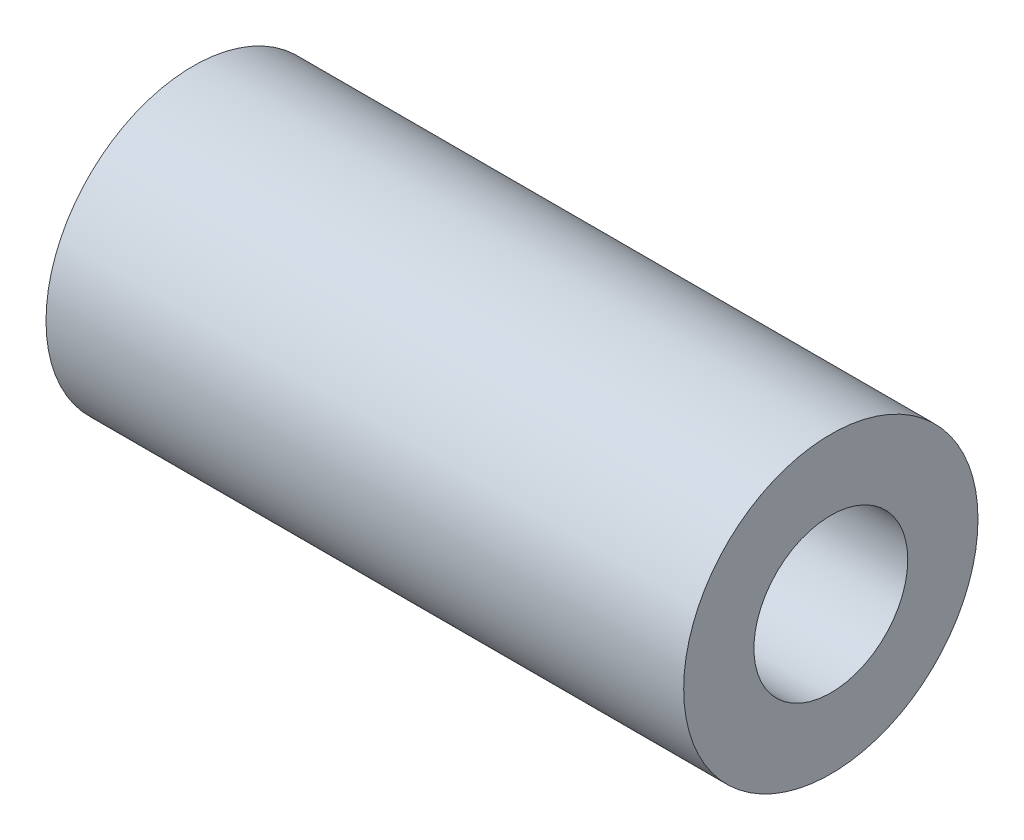
ISO-10303-21;
HEADER;
FILE_DESCRIPTION(('STEP AP214'),'2;1');
FILE_NAME('part.step','',(''),(''),'','','');
FILE_SCHEMA(('AUTOMOTIVE_DESIGN { 1 0 10303 214 1 1 1 1 }'));
ENDSEC;
DATA;
#1=APPLICATION_CONTEXT('core data for automotive mechanical design processes');
#2=APPLICATION_PROTOCOL_DEFINITION('international standard','automotive_design',2000,#1);
#3=PRODUCT_CONTEXT('',#1,'mechanical');
#4=PRODUCT('Part','Part','',(#3));
#5=PRODUCT_RELATED_PRODUCT_CATEGORY('part','',(#4));
#6=PRODUCT_DEFINITION_FORMATION('','',#4);
#7=PRODUCT_DEFINITION_CONTEXT('part definition',#1,'design');
#8=PRODUCT_DEFINITION('design','',#6,#7);
#9=PRODUCT_DEFINITION_SHAPE('','',#8);
#10=(LENGTH_UNIT() NAMED_UNIT(*) SI_UNIT(.MILLI.,.METRE.));
#11=(NAMED_UNIT(*) PLANE_ANGLE_UNIT() SI_UNIT($,.RADIAN.));
#12=(NAMED_UNIT(*) SI_UNIT($,.STERADIAN.) SOLID_ANGLE_UNIT());
#13=UNCERTAINTY_MEASURE_WITH_UNIT(LENGTH_MEASURE(1.E-05),#10,'distance_accuracy_value','');
#14=(GEOMETRIC_REPRESENTATION_CONTEXT(3) GLOBAL_UNCERTAINTY_ASSIGNED_CONTEXT((#13)) GLOBAL_UNIT_ASSIGNED_CONTEXT((#10,
#11,#12)) REPRESENTATION_CONTEXT('',''));
#15=CARTESIAN_POINT('',(0.,0.,0.));
#16=DIRECTION('',(0.,0.,1.));
#17=DIRECTION('',(1.,0.,0.));
#18=AXIS2_PLACEMENT_3D('',#15,#16,#17);
#19=CARTESIAN_POINT('',(10.31875,0.,0.));
#20=DIRECTION('',(1.,0.,0.));
#21=DIRECTION('',(0.,0.,-1.));
#22=AXIS2_PLACEMENT_3D('',#19,#20,#21);
#23=PLANE('',#22);
#24=CARTESIAN_POINT('',(10.31875,0.,0.));
#25=DIRECTION('',(1.,0.,0.));
#26=DIRECTION('',(0.,0.,-1.));
#27=AXIS2_PLACEMENT_3D('',#24,#25,#26);
#28=CIRCLE('',#27,4.7625);
#29=CARTESIAN_POINT('',(10.31875,0.,-4.7625));
#30=VERTEX_POINT('',#29);
#31=EDGE_CURVE('E10',#30,#30,#28,.T.);
#32=ORIENTED_EDGE('',*,*,#31,.T.);
#33=EDGE_LOOP('',(#32));
#34=FACE_BOUND('',#33,.T.);
#35=CARTESIAN_POINT('',(10.31875,0.,0.));
#36=DIRECTION('',(1.,0.,0.));
#37=DIRECTION('',(0.,0.,-1.));
#38=AXIS2_PLACEMENT_3D('',#35,#36,#37);
#39=CIRCLE('',#38,2.4892);
#40=CARTESIAN_POINT('',(10.31875,0.,-2.4892));
#41=VERTEX_POINT('',#40);
#42=EDGE_CURVE('E46',#41,#41,#39,.T.);
#43=ORIENTED_EDGE('',*,*,#42,.F.);
#44=EDGE_LOOP('',(#43));
#45=FACE_BOUND('',#44,.T.);
#46=ADVANCED_FACE('F35',(#34,#45),#23,.T.);
#47=CARTESIAN_POINT('',(-10.31875,0.,0.));
#48=DIRECTION('',(1.,0.,0.));
#49=DIRECTION('',(0.,0.,-1.));
#50=AXIS2_PLACEMENT_3D('',#47,#48,#49);
#51=PLANE('',#50);
#52=CARTESIAN_POINT('',(-10.31875,0.,0.));
#53=DIRECTION('',(1.,0.,0.));
#54=DIRECTION('',(0.,0.,-1.));
#55=AXIS2_PLACEMENT_3D('',#52,#53,#54);
#56=CIRCLE('',#55,4.7625);
#57=CARTESIAN_POINT('',(-10.31875,0.,-4.7625));
#58=VERTEX_POINT('',#57);
#59=EDGE_CURVE('E39',#58,#58,#56,.T.);
#60=ORIENTED_EDGE('',*,*,#59,.F.);
#61=EDGE_LOOP('',(#60));
#62=FACE_BOUND('',#61,.T.);
#63=CARTESIAN_POINT('',(-10.31875,0.,0.));
#64=DIRECTION('',(1.,0.,0.));
#65=DIRECTION('',(0.,0.,-1.));
#66=AXIS2_PLACEMENT_3D('',#63,#64,#65);
#67=CIRCLE('',#66,2.4892);
#68=CARTESIAN_POINT('',(-10.31875,0.,-2.4892));
#69=VERTEX_POINT('',#68);
#70=EDGE_CURVE('E48',#69,#69,#67,.T.);
#71=ORIENTED_EDGE('',*,*,#70,.T.);
#72=EDGE_LOOP('',(#71));
#73=FACE_BOUND('',#72,.T.);
#74=ADVANCED_FACE('F58',(#62,#73),#51,.F.);
#75=CARTESIAN_POINT('',(10.31875,0.,0.));
#76=DIRECTION('',(-1.,0.,0.));
#77=DIRECTION('',(0.,0.,1.));
#78=AXIS2_PLACEMENT_3D('',#75,#76,#77);
#79=CYLINDRICAL_SURFACE('',#78,4.7625);
#80=ORIENTED_EDGE('',*,*,#31,.F.);
#81=EDGE_LOOP('',(#80));
#82=FACE_BOUND('',#81,.T.);
#83=ORIENTED_EDGE('',*,*,#59,.T.);
#84=EDGE_LOOP('',(#83));
#85=FACE_BOUND('',#84,.T.);
#86=ADVANCED_FACE('F37',(#82,#85),#79,.T.);
#87=CARTESIAN_POINT('',(10.31875,0.,0.));
#88=DIRECTION('',(-1.,0.,0.));
#89=DIRECTION('',(0.,0.,1.));
#90=AXIS2_PLACEMENT_3D('',#87,#88,#89);
#91=CYLINDRICAL_SURFACE('',#90,2.4892);
#92=ORIENTED_EDGE('',*,*,#42,.T.);
#93=EDGE_LOOP('',(#92));
#94=FACE_BOUND('',#93,.T.);
#95=ORIENTED_EDGE('',*,*,#70,.F.);
#96=EDGE_LOOP('',(#95));
#97=FACE_BOUND('',#96,.T.);
#98=ADVANCED_FACE('F54',(#94,#97),#91,.F.);
#99=CLOSED_SHELL('',(#46,#74,#86,#98));
#100=MANIFOLD_SOLID_BREP('B2',#99);
#101=ADVANCED_BREP_SHAPE_REPRESENTATION('',(#18,#100),#14);
#102=SHAPE_DEFINITION_REPRESENTATION(#9,#101);
ENDSEC;
END-ISO-10303-21;
